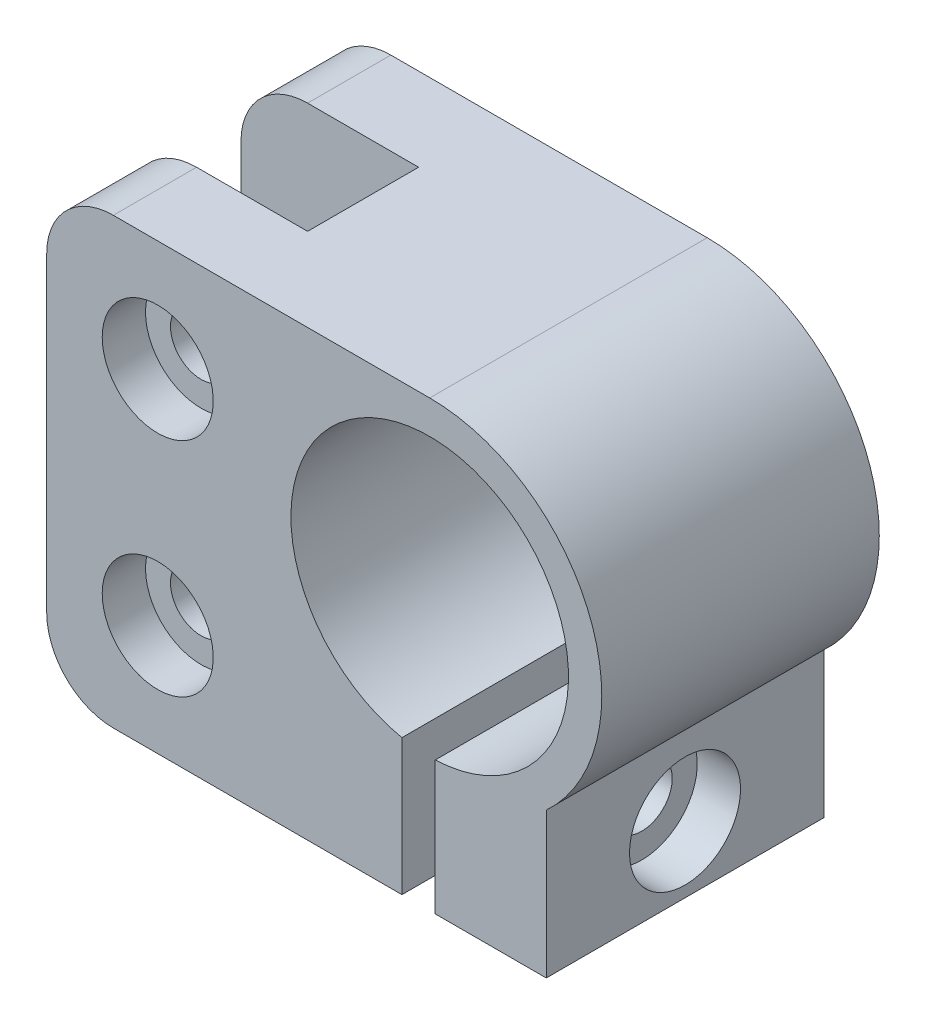
ISO-10303-21;
HEADER;
FILE_DESCRIPTION(('STEP AP214'),'2;1');
FILE_NAME('part.step','',(''),(''),'','','');
FILE_SCHEMA(('AUTOMOTIVE_DESIGN { 1 0 10303 214 1 1 1 1 }'));
ENDSEC;
DATA;
#1=APPLICATION_CONTEXT('core data for automotive mechanical design processes');
#2=APPLICATION_PROTOCOL_DEFINITION('international standard','automotive_design',2000,#1);
#3=PRODUCT_CONTEXT('',#1,'mechanical');
#4=PRODUCT('Part','Part','',(#3));
#5=PRODUCT_RELATED_PRODUCT_CATEGORY('part','',(#4));
#6=PRODUCT_DEFINITION_FORMATION('','',#4);
#7=PRODUCT_DEFINITION_CONTEXT('part definition',#1,'design');
#8=PRODUCT_DEFINITION('design','',#6,#7);
#9=PRODUCT_DEFINITION_SHAPE('','',#8);
#10=(LENGTH_UNIT() NAMED_UNIT(*) SI_UNIT(.MILLI.,.METRE.));
#11=(NAMED_UNIT(*) PLANE_ANGLE_UNIT() SI_UNIT($,.RADIAN.));
#12=(NAMED_UNIT(*) SI_UNIT($,.STERADIAN.) SOLID_ANGLE_UNIT());
#13=UNCERTAINTY_MEASURE_WITH_UNIT(LENGTH_MEASURE(1.E-05),#10,'distance_accuracy_value','');
#14=(GEOMETRIC_REPRESENTATION_CONTEXT(3) GLOBAL_UNCERTAINTY_ASSIGNED_CONTEXT((#13)) GLOBAL_UNIT_ASSIGNED_CONTEXT((#10,
#11,#12)) REPRESENTATION_CONTEXT('',''));
#15=CARTESIAN_POINT('',(0.,0.,0.));
#16=DIRECTION('',(0.,0.,1.));
#17=DIRECTION('',(1.,0.,0.));
#18=AXIS2_PLACEMENT_3D('',#15,#16,#17);
#19=CARTESIAN_POINT('',(12.,4.5,12.5));
#20=DIRECTION('',(0.,0.,-1.));
#21=DIRECTION('',(1.,0.,0.));
#22=AXIS2_PLACEMENT_3D('',#19,#20,#21);
#23=PLANE('',#22);
#24=CARTESIAN_POINT('',(-12.5,-10.,12.5));
#25=DIRECTION('',(0.,0.,-1.));
#26=DIRECTION('',(-1.,0.,0.));
#27=AXIS2_PLACEMENT_3D('',#24,#25,#26);
#28=CIRCLE('',#27,4.99999999999999);
#29=CARTESIAN_POINT('',(-17.5,-10.,12.5));
#30=VERTEX_POINT('',#29);
#31=EDGE_CURVE('E318',#30,#30,#28,.T.);
#32=ORIENTED_EDGE('',*,*,#31,.T.);
#33=EDGE_LOOP('',(#32));
#34=FACE_BOUND('',#33,.T.);
#35=DIRECTION('',(1.,0.,0.));
#36=VECTOR('',#35,1.);
#37=CARTESIAN_POINT('',(22.5,-20.,12.5));
#38=LINE('',#37,#36);
#39=CARTESIAN_POINT('',(12.5,-20.,12.5));
#40=VERTEX_POINT('',#39);
#41=CARTESIAN_POINT('',(22.5,-20.,12.5));
#42=VERTEX_POINT('',#41);
#43=EDGE_CURVE('E246',#40,#42,#38,.T.);
#44=ORIENTED_EDGE('',*,*,#43,.T.);
#45=DIRECTION('',(0.,1.,0.));
#46=VECTOR('',#45,1.);
#47=CARTESIAN_POINT('',(22.5,-6.90175425099139,12.5));
#48=LINE('',#47,#46);
#49=CARTESIAN_POINT('',(22.5,-6.90175425099139,12.5));
#50=VERTEX_POINT('',#49);
#51=EDGE_CURVE('E250',#42,#50,#48,.T.);
#52=ORIENTED_EDGE('',*,*,#51,.T.);
#53=CARTESIAN_POINT('',(12.,4.5,12.5));
#54=DIRECTION('',(0.,0.,1.));
#55=DIRECTION('',(1.,0.,0.));
#56=AXIS2_PLACEMENT_3D('',#53,#54,#55);
#57=CIRCLE('',#56,15.5);
#58=CARTESIAN_POINT('',(12.,20.,12.5));
#59=VERTEX_POINT('',#58);
#60=EDGE_CURVE('E253',#50,#59,#57,.T.);
#61=ORIENTED_EDGE('',*,*,#60,.T.);
#62=DIRECTION('',(-1.,0.,0.));
#63=VECTOR('',#62,1.);
#64=CARTESIAN_POINT('',(12.,20.,12.5));
#65=LINE('',#64,#63);
#66=CARTESIAN_POINT('',(-16.5,20.,12.5));
#67=VERTEX_POINT('',#66);
#68=EDGE_CURVE('E230',#59,#67,#65,.T.);
#69=ORIENTED_EDGE('',*,*,#68,.T.);
#70=CARTESIAN_POINT('',(-16.5,14.,12.5));
#71=DIRECTION('',(0.,0.,1.));
#72=DIRECTION('',(1.,0.,0.));
#73=AXIS2_PLACEMENT_3D('',#70,#71,#72);
#74=CIRCLE('',#73,6.);
#75=CARTESIAN_POINT('',(-22.5,14.,12.5));
#76=VERTEX_POINT('',#75);
#77=EDGE_CURVE('E271',#76,#67,#74,.F.);
#78=ORIENTED_EDGE('',*,*,#77,.F.);
#79=DIRECTION('',(0.,-1.,0.));
#80=VECTOR('',#79,1.);
#81=CARTESIAN_POINT('',(-22.5,20.,12.5));
#82=LINE('',#81,#80);
#83=CARTESIAN_POINT('',(-22.5,-14.,12.5));
#84=VERTEX_POINT('',#83);
#85=EDGE_CURVE('E219',#76,#84,#82,.T.);
#86=ORIENTED_EDGE('',*,*,#85,.T.);
#87=CARTESIAN_POINT('',(-16.5,-14.,12.5));
#88=DIRECTION('',(0.,0.,1.));
#89=DIRECTION('',(1.,0.,0.));
#90=AXIS2_PLACEMENT_3D('',#87,#88,#89);
#91=CIRCLE('',#90,6.);
#92=CARTESIAN_POINT('',(-16.5,-20.,12.5));
#93=VERTEX_POINT('',#92);
#94=EDGE_CURVE('E268',#93,#84,#91,.F.);
#95=ORIENTED_EDGE('',*,*,#94,.F.);
#96=CARTESIAN_POINT('',(9.5,-20.,12.5));
#97=VERTEX_POINT('',#96);
#98=EDGE_CURVE('E247',#93,#97,#38,.T.);
#99=ORIENTED_EDGE('',*,*,#98,.T.);
#100=DIRECTION('',(0.,1.,0.));
#101=VECTOR('',#100,1.);
#102=CARTESIAN_POINT('',(9.5,-20.,12.5));
#103=LINE('',#102,#101);
#104=CARTESIAN_POINT('',(9.5,-7.74744871391588,12.5));
#105=VERTEX_POINT('',#104);
#106=EDGE_CURVE('E182',#97,#105,#103,.T.);
#107=ORIENTED_EDGE('',*,*,#106,.T.);
#108=CARTESIAN_POINT('',(12.,4.5,12.5));
#109=DIRECTION('',(0.,0.,1.));
#110=DIRECTION('',(1.,0.,0.));
#111=AXIS2_PLACEMENT_3D('',#108,#109,#110);
#112=CIRCLE('',#111,12.5);
#113=CARTESIAN_POINT('',(12.5,-7.98999599679679,12.5));
#114=VERTEX_POINT('',#113);
#115=EDGE_CURVE('E193',#114,#105,#112,.T.);
#116=ORIENTED_EDGE('',*,*,#115,.F.);
#117=DIRECTION('',(0.,-1.,0.));
#118=VECTOR('',#117,1.);
#119=CARTESIAN_POINT('',(12.5,-20.,12.5));
#120=LINE('',#119,#118);
#121=EDGE_CURVE('E178',#114,#40,#120,.T.);
#122=ORIENTED_EDGE('',*,*,#121,.T.);
#123=EDGE_LOOP('',(#44,#52,#61,#69,#78,#86,#95,#99,#107,#116,#122));
#124=FACE_BOUND('',#123,.T.);
#125=CARTESIAN_POINT('',(-12.5,10.,12.5));
#126=DIRECTION('',(0.,0.,-1.));
#127=DIRECTION('',(-1.,0.,0.));
#128=AXIS2_PLACEMENT_3D('',#125,#126,#127);
#129=CIRCLE('',#128,4.99999999999999);
#130=CARTESIAN_POINT('',(-17.5,10.,12.5));
#131=VERTEX_POINT('',#130);
#132=EDGE_CURVE('E650',#131,#131,#129,.T.);
#133=ORIENTED_EDGE('',*,*,#132,.T.);
#134=EDGE_LOOP('',(#133));
#135=FACE_BOUND('',#134,.T.);
#136=ADVANCED_FACE('F35',(#34,#124,#135),#23,.F.);
#137=CARTESIAN_POINT('',(22.5,-20.,-12.5));
#138=DIRECTION('',(0.,1.,0.));
#139=DIRECTION('',(-1.,0.,0.));
#140=AXIS2_PLACEMENT_3D('',#137,#138,#139);
#141=PLANE('',#140);
#142=DIRECTION('',(1.,0.,0.));
#143=VECTOR('',#142,1.);
#144=CARTESIAN_POINT('',(22.5,-20.,-12.5));
#145=LINE('',#144,#143);
#146=CARTESIAN_POINT('',(12.5,-20.,-12.5));
#147=VERTEX_POINT('',#146);
#148=CARTESIAN_POINT('',(22.5,-20.,-12.5));
#149=VERTEX_POINT('',#148);
#150=EDGE_CURVE('E229',#147,#149,#145,.T.);
#151=ORIENTED_EDGE('',*,*,#150,.T.);
#152=DIRECTION('',(0.,0.,1.));
#153=VECTOR('',#152,1.);
#154=CARTESIAN_POINT('',(22.5,-20.,-12.5));
#155=LINE('',#154,#153);
#156=EDGE_CURVE('E261',#149,#42,#155,.T.);
#157=ORIENTED_EDGE('',*,*,#156,.T.);
#158=ORIENTED_EDGE('',*,*,#43,.F.);
#159=DIRECTION('',(0.,0.,1.));
#160=VECTOR('',#159,1.);
#161=CARTESIAN_POINT('',(12.5,-20.,-12.5));
#162=LINE('',#161,#160);
#163=EDGE_CURVE('E184',#147,#40,#162,.T.);
#164=ORIENTED_EDGE('',*,*,#163,.F.);
#165=EDGE_LOOP('',(#151,#157,#158,#164));
#166=FACE_BOUND('',#165,.T.);
#167=ADVANCED_FACE('F346',(#166),#141,.F.);
#168=CARTESIAN_POINT('',(-22.5,20.,-12.5));
#169=DIRECTION('',(1.,0.,0.));
#170=DIRECTION('',(0.,1.,0.));
#171=AXIS2_PLACEMENT_3D('',#168,#169,#170);
#172=PLANE('',#171);
#173=DIRECTION('',(0.,1.,0.));
#174=VECTOR('',#173,1.);
#175=CARTESIAN_POINT('',(-22.5,-20.,5.));
#176=LINE('',#175,#174);
#177=CARTESIAN_POINT('',(-22.5,-14.,5.));
#178=VERTEX_POINT('',#177);
#179=CARTESIAN_POINT('',(-22.5,14.,5.));
#180=VERTEX_POINT('',#179);
#181=EDGE_CURVE('E216',#178,#180,#176,.T.);
#182=ORIENTED_EDGE('',*,*,#181,.F.);
#183=DIRECTION('',(0.,0.,1.));
#184=VECTOR('',#183,1.);
#185=CARTESIAN_POINT('',(-22.5,-14.,-12.5));
#186=LINE('',#185,#184);
#187=EDGE_CURVE('E263',#84,#178,#186,.F.);
#188=ORIENTED_EDGE('',*,*,#187,.F.);
#189=ORIENTED_EDGE('',*,*,#85,.F.);
#190=DIRECTION('',(0.,0.,1.));
#191=VECTOR('',#190,1.);
#192=CARTESIAN_POINT('',(-22.5,14.,-12.5));
#193=LINE('',#192,#191);
#194=EDGE_CURVE('E266',#180,#76,#193,.T.);
#195=ORIENTED_EDGE('',*,*,#194,.F.);
#196=EDGE_LOOP('',(#182,#188,#189,#195));
#197=FACE_BOUND('',#196,.T.);
#198=ADVANCED_FACE('F352',(#197),#172,.F.);
#199=DIRECTION('',(0.,-1.,0.));
#200=VECTOR('',#199,1.);
#201=CARTESIAN_POINT('',(-22.5,20.,-12.5));
#202=LINE('',#201,#200);
#203=CARTESIAN_POINT('',(-22.5,14.,-12.5));
#204=VERTEX_POINT('',#203);
#205=CARTESIAN_POINT('',(-22.5,-14.,-12.5));
#206=VERTEX_POINT('',#205);
#207=EDGE_CURVE('E226',#204,#206,#202,.T.);
#208=ORIENTED_EDGE('',*,*,#207,.T.);
#209=DIRECTION('',(0.,0.,1.));
#210=VECTOR('',#209,1.);
#211=CARTESIAN_POINT('',(-22.5,-14.,-12.5));
#212=LINE('',#211,#210);
#213=CARTESIAN_POINT('',(-22.5,-14.,-5.));
#214=VERTEX_POINT('',#213);
#215=EDGE_CURVE('E284',#214,#206,#212,.F.);
#216=ORIENTED_EDGE('',*,*,#215,.F.);
#217=DIRECTION('',(0.,1.,0.));
#218=VECTOR('',#217,1.);
#219=CARTESIAN_POINT('',(-22.5,-20.,-5.));
#220=LINE('',#219,#218);
#221=CARTESIAN_POINT('',(-22.5,14.,-5.));
#222=VERTEX_POINT('',#221);
#223=EDGE_CURVE('E208',#214,#222,#220,.T.);
#224=ORIENTED_EDGE('',*,*,#223,.T.);
#225=DIRECTION('',(0.,0.,1.));
#226=VECTOR('',#225,1.);
#227=CARTESIAN_POINT('',(-22.5,14.,-12.5));
#228=LINE('',#227,#226);
#229=EDGE_CURVE('E287',#204,#222,#228,.T.);
#230=ORIENTED_EDGE('',*,*,#229,.F.);
#231=EDGE_LOOP('',(#208,#216,#224,#230));
#232=FACE_BOUND('',#231,.T.);
#233=ADVANCED_FACE('F375',(#232),#172,.F.);
#234=ORIENTED_EDGE('',*,*,#98,.F.);
#235=DIRECTION('',(0.,0.,1.));
#236=VECTOR('',#235,1.);
#237=CARTESIAN_POINT('',(-16.5,-20.,-12.5));
#238=LINE('',#237,#236);
#239=CARTESIAN_POINT('',(-16.5,-20.,5.));
#240=VERTEX_POINT('',#239);
#241=EDGE_CURVE('E298',#240,#93,#238,.T.);
#242=ORIENTED_EDGE('',*,*,#241,.F.);
#243=DIRECTION('',(-1.,0.,0.));
#244=VECTOR('',#243,1.);
#245=CARTESIAN_POINT('',(-22.5,-20.,5.));
#246=LINE('',#245,#244);
#247=CARTESIAN_POINT('',(-6.49999999999999,-20.,5.));
#248=VERTEX_POINT('',#247);
#249=EDGE_CURVE('E205',#248,#240,#246,.T.);
#250=ORIENTED_EDGE('',*,*,#249,.F.);
#251=DIRECTION('',(0.,0.,1.));
#252=VECTOR('',#251,1.);
#253=CARTESIAN_POINT('',(-6.49999999999999,-20.,5.));
#254=LINE('',#253,#252);
#255=CARTESIAN_POINT('',(-6.49999999999999,-20.,-5.));
#256=VERTEX_POINT('',#255);
#257=EDGE_CURVE('E201',#256,#248,#254,.T.);
#258=ORIENTED_EDGE('',*,*,#257,.F.);
#259=DIRECTION('',(1.,0.,0.));
#260=VECTOR('',#259,1.);
#261=CARTESIAN_POINT('',(-22.5,-20.,-5.));
#262=LINE('',#261,#260);
#263=CARTESIAN_POINT('',(-16.5,-20.,-5.));
#264=VERTEX_POINT('',#263);
#265=EDGE_CURVE('E198',#264,#256,#262,.T.);
#266=ORIENTED_EDGE('',*,*,#265,.F.);
#267=DIRECTION('',(0.,0.,1.));
#268=VECTOR('',#267,1.);
#269=CARTESIAN_POINT('',(-16.5,-20.,-12.5));
#270=LINE('',#269,#268);
#271=CARTESIAN_POINT('',(-16.5,-20.,-12.5));
#272=VERTEX_POINT('',#271);
#273=EDGE_CURVE('E300',#272,#264,#270,.T.);
#274=ORIENTED_EDGE('',*,*,#273,.F.);
#275=CARTESIAN_POINT('',(9.5,-20.,-12.5));
#276=VERTEX_POINT('',#275);
#277=EDGE_CURVE('E231',#272,#276,#145,.T.);
#278=ORIENTED_EDGE('',*,*,#277,.T.);
#279=DIRECTION('',(0.,0.,1.));
#280=VECTOR('',#279,1.);
#281=CARTESIAN_POINT('',(9.5,-20.,-12.5));
#282=LINE('',#281,#280);
#283=EDGE_CURVE('E189',#276,#97,#282,.T.);
#284=ORIENTED_EDGE('',*,*,#283,.T.);
#285=EDGE_LOOP('',(#234,#242,#250,#258,#266,#274,#278,#284));
#286=FACE_BOUND('',#285,.T.);
#287=ADVANCED_FACE('F355',(#286),#141,.F.);
#288=CARTESIAN_POINT('',(22.5,-6.90175425099139,-12.5));
#289=DIRECTION('',(-1.,0.,0.));
#290=DIRECTION('',(0.,-1.,0.));
#291=AXIS2_PLACEMENT_3D('',#288,#289,#290);
#292=PLANE('',#291);
#293=CARTESIAN_POINT('',(22.5,-14.,0.));
#294=DIRECTION('',(-1.,0.,0.));
#295=DIRECTION('',(0.,0.,1.));
#296=AXIS2_PLACEMENT_3D('',#293,#294,#295);
#297=CIRCLE('',#296,5.);
#298=CARTESIAN_POINT('',(22.5,-14.,5.));
#299=VERTEX_POINT('',#298);
#300=EDGE_CURVE('E324',#299,#299,#297,.T.);
#301=ORIENTED_EDGE('',*,*,#300,.T.);
#302=EDGE_LOOP('',(#301));
#303=FACE_BOUND('',#302,.T.);
#304=ORIENTED_EDGE('',*,*,#51,.F.);
#305=ORIENTED_EDGE('',*,*,#156,.F.);
#306=DIRECTION('',(0.,1.,0.));
#307=VECTOR('',#306,1.);
#308=CARTESIAN_POINT('',(22.5,-6.90175425099139,-12.5));
#309=LINE('',#308,#307);
#310=CARTESIAN_POINT('',(22.5,-6.90175425099139,-12.5));
#311=VERTEX_POINT('',#310);
#312=EDGE_CURVE('E234',#149,#311,#309,.T.);
#313=ORIENTED_EDGE('',*,*,#312,.T.);
#314=DIRECTION('',(0.,0.,1.));
#315=VECTOR('',#314,1.);
#316=CARTESIAN_POINT('',(22.5,-6.90175425099139,-12.5));
#317=LINE('',#316,#315);
#318=EDGE_CURVE('E259',#311,#50,#317,.T.);
#319=ORIENTED_EDGE('',*,*,#318,.T.);
#320=EDGE_LOOP('',(#304,#305,#313,#319));
#321=FACE_BOUND('',#320,.T.);
#322=ADVANCED_FACE('F369',(#303,#321),#292,.F.);
#323=CARTESIAN_POINT('',(12.,4.5,-12.5));
#324=DIRECTION('',(0.,0.,1.));
#325=DIRECTION('',(-1.,0.,0.));
#326=AXIS2_PLACEMENT_3D('',#323,#324,#325);
#327=CYLINDRICAL_SURFACE('',#326,15.5);
#328=ORIENTED_EDGE('',*,*,#60,.F.);
#329=ORIENTED_EDGE('',*,*,#318,.F.);
#330=CARTESIAN_POINT('',(12.,4.5,-12.5));
#331=DIRECTION('',(0.,0.,1.));
#332=DIRECTION('',(1.,0.,0.));
#333=AXIS2_PLACEMENT_3D('',#330,#331,#332);
#334=CIRCLE('',#333,15.5);
#335=CARTESIAN_POINT('',(12.,20.,-12.5));
#336=VERTEX_POINT('',#335);
#337=EDGE_CURVE('E237',#311,#336,#334,.T.);
#338=ORIENTED_EDGE('',*,*,#337,.T.);
#339=DIRECTION('',(0.,0.,1.));
#340=VECTOR('',#339,1.);
#341=CARTESIAN_POINT('',(12.,20.,-12.5));
#342=LINE('',#341,#340);
#343=EDGE_CURVE('E243',#336,#59,#342,.T.);
#344=ORIENTED_EDGE('',*,*,#343,.T.);
#345=EDGE_LOOP('',(#328,#329,#338,#344));
#346=FACE_BOUND('',#345,.T.);
#347=ADVANCED_FACE('F365',(#346),#327,.T.);
#348=CARTESIAN_POINT('',(12.,20.,-12.5));
#349=DIRECTION('',(0.,-1.,0.));
#350=DIRECTION('',(1.,0.,0.));
#351=AXIS2_PLACEMENT_3D('',#348,#349,#350);
#352=PLANE('',#351);
#353=ORIENTED_EDGE('',*,*,#68,.F.);
#354=ORIENTED_EDGE('',*,*,#343,.F.);
#355=DIRECTION('',(-1.,0.,0.));
#356=VECTOR('',#355,1.);
#357=CARTESIAN_POINT('',(12.,20.,-12.5));
#358=LINE('',#357,#356);
#359=CARTESIAN_POINT('',(-16.5,20.,-12.5));
#360=VERTEX_POINT('',#359);
#361=EDGE_CURVE('E240',#336,#360,#358,.T.);
#362=ORIENTED_EDGE('',*,*,#361,.T.);
#363=DIRECTION('',(0.,0.,1.));
#364=VECTOR('',#363,1.);
#365=CARTESIAN_POINT('',(-16.5,20.,-12.5));
#366=LINE('',#365,#364);
#367=CARTESIAN_POINT('',(-16.5,20.,-5.));
#368=VERTEX_POINT('',#367);
#369=EDGE_CURVE('E274',#368,#360,#366,.F.);
#370=ORIENTED_EDGE('',*,*,#369,.F.);
#371=DIRECTION('',(1.,0.,0.));
#372=VECTOR('',#371,1.);
#373=CARTESIAN_POINT('',(-22.5,20.,-5.));
#374=LINE('',#373,#372);
#375=CARTESIAN_POINT('',(-6.5,20.,-5.));
#376=VERTEX_POINT('',#375);
#377=EDGE_CURVE('E195',#368,#376,#374,.T.);
#378=ORIENTED_EDGE('',*,*,#377,.T.);
#379=DIRECTION('',(0.,0.,1.));
#380=VECTOR('',#379,1.);
#381=CARTESIAN_POINT('',(-6.5,20.,5.));
#382=LINE('',#381,#380);
#383=CARTESIAN_POINT('',(-6.5,20.,5.));
#384=VERTEX_POINT('',#383);
#385=EDGE_CURVE('E211',#376,#384,#382,.T.);
#386=ORIENTED_EDGE('',*,*,#385,.T.);
#387=DIRECTION('',(-1.,0.,0.));
#388=VECTOR('',#387,1.);
#389=CARTESIAN_POINT('',(-22.5,20.,5.));
#390=LINE('',#389,#388);
#391=CARTESIAN_POINT('',(-16.5,20.,5.));
#392=VERTEX_POINT('',#391);
#393=EDGE_CURVE('E202',#384,#392,#390,.T.);
#394=ORIENTED_EDGE('',*,*,#393,.T.);
#395=DIRECTION('',(0.,0.,1.));
#396=VECTOR('',#395,1.);
#397=CARTESIAN_POINT('',(-16.5,20.,-12.5));
#398=LINE('',#397,#396);
#399=EDGE_CURVE('E277',#67,#392,#398,.F.);
#400=ORIENTED_EDGE('',*,*,#399,.F.);
#401=EDGE_LOOP('',(#353,#354,#362,#370,#378,#386,#394,#400));
#402=FACE_BOUND('',#401,.T.);
#403=ADVANCED_FACE('F362',(#402),#352,.F.);
#404=CARTESIAN_POINT('',(12.,4.5,-12.5));
#405=DIRECTION('',(0.,0.,-1.));
#406=DIRECTION('',(1.,0.,0.));
#407=AXIS2_PLACEMENT_3D('',#404,#405,#406);
#408=PLANE('',#407);
#409=CARTESIAN_POINT('',(-12.5,10.,-12.5));
#410=DIRECTION('',(0.,0.,1.));
#411=DIRECTION('',(1.,0.,0.));
#412=AXIS2_PLACEMENT_3D('',#409,#410,#411);
#413=CIRCLE('',#412,2.75);
#414=CARTESIAN_POINT('',(-9.75,10.,-12.5));
#415=VERTEX_POINT('',#414);
#416=EDGE_CURVE('E657',#415,#415,#413,.T.);
#417=ORIENTED_EDGE('',*,*,#416,.T.);
#418=EDGE_LOOP('',(#417));
#419=FACE_BOUND('',#418,.T.);
#420=CARTESIAN_POINT('',(-12.5,-10.,-12.5));
#421=DIRECTION('',(0.,0.,1.));
#422=DIRECTION('',(1.,0.,0.));
#423=AXIS2_PLACEMENT_3D('',#420,#421,#422);
#424=CIRCLE('',#423,2.75);
#425=CARTESIAN_POINT('',(-9.75,-10.,-12.5));
#426=VERTEX_POINT('',#425);
#427=EDGE_CURVE('E305',#426,#426,#424,.T.);
#428=ORIENTED_EDGE('',*,*,#427,.T.);
#429=EDGE_LOOP('',(#428));
#430=FACE_BOUND('',#429,.T.);
#431=DIRECTION('',(0.,-1.,0.));
#432=VECTOR('',#431,1.);
#433=CARTESIAN_POINT('',(12.5,-20.,-12.5));
#434=LINE('',#433,#432);
#435=CARTESIAN_POINT('',(12.5,-7.98999599679679,-12.5));
#436=VERTEX_POINT('',#435);
#437=EDGE_CURVE('E179',#436,#147,#434,.T.);
#438=ORIENTED_EDGE('',*,*,#437,.F.);
#439=CARTESIAN_POINT('',(12.,4.5,-12.5));
#440=DIRECTION('',(0.,0.,1.));
#441=DIRECTION('',(1.,0.,0.));
#442=AXIS2_PLACEMENT_3D('',#439,#440,#441);
#443=CIRCLE('',#442,12.5);
#444=CARTESIAN_POINT('',(9.5,-7.74744871391588,-12.5));
#445=VERTEX_POINT('',#444);
#446=EDGE_CURVE('E191',#436,#445,#443,.T.);
#447=ORIENTED_EDGE('',*,*,#446,.T.);
#448=DIRECTION('',(0.,1.,0.));
#449=VECTOR('',#448,1.);
#450=CARTESIAN_POINT('',(9.5,-20.,-12.5));
#451=LINE('',#450,#449);
#452=EDGE_CURVE('E181',#276,#445,#451,.T.);
#453=ORIENTED_EDGE('',*,*,#452,.F.);
#454=ORIENTED_EDGE('',*,*,#277,.F.);
#455=CARTESIAN_POINT('',(-16.5,-14.,-12.5));
#456=DIRECTION('',(0.,0.,1.));
#457=DIRECTION('',(1.,0.,0.));
#458=AXIS2_PLACEMENT_3D('',#455,#456,#457);
#459=CIRCLE('',#458,6.);
#460=EDGE_CURVE('E294',#206,#272,#459,.T.);
#461=ORIENTED_EDGE('',*,*,#460,.F.);
#462=ORIENTED_EDGE('',*,*,#207,.F.);
#463=CARTESIAN_POINT('',(-16.5,14.,-12.5));
#464=DIRECTION('',(0.,0.,1.));
#465=DIRECTION('',(1.,0.,0.));
#466=AXIS2_PLACEMENT_3D('',#463,#464,#465);
#467=CIRCLE('',#466,6.);
#468=EDGE_CURVE('E296',#360,#204,#467,.T.);
#469=ORIENTED_EDGE('',*,*,#468,.F.);
#470=ORIENTED_EDGE('',*,*,#361,.F.);
#471=ORIENTED_EDGE('',*,*,#337,.F.);
#472=ORIENTED_EDGE('',*,*,#312,.F.);
#473=ORIENTED_EDGE('',*,*,#150,.F.);
#474=EDGE_LOOP('',(#438,#447,#453,#454,#461,#462,#469,#470,#471,#472,#473));
#475=FACE_BOUND('',#474,.T.);
#476=ADVANCED_FACE('F360',(#419,#430,#475),#408,.T.);
#477=CARTESIAN_POINT('',(-22.5,-20.,5.));
#478=DIRECTION('',(0.,0.,1.));
#479=DIRECTION('',(-1.,0.,0.));
#480=AXIS2_PLACEMENT_3D('',#477,#478,#479);
#481=PLANE('',#480);
#482=CARTESIAN_POINT('',(-12.5,10.,5.));
#483=DIRECTION('',(0.,0.,-1.));
#484=DIRECTION('',(-1.,0.,0.));
#485=AXIS2_PLACEMENT_3D('',#482,#483,#484);
#486=CIRCLE('',#485,2.75);
#487=CARTESIAN_POINT('',(-15.25,10.,5.));
#488=VERTEX_POINT('',#487);
#489=EDGE_CURVE('E660',#488,#488,#486,.T.);
#490=ORIENTED_EDGE('',*,*,#489,.F.);
#491=EDGE_LOOP('',(#490));
#492=FACE_BOUND('',#491,.T.);
#493=CARTESIAN_POINT('',(-12.5,-10.,5.));
#494=DIRECTION('',(0.,0.,-1.));
#495=DIRECTION('',(-1.,0.,0.));
#496=AXIS2_PLACEMENT_3D('',#493,#494,#495);
#497=CIRCLE('',#496,2.75);
#498=CARTESIAN_POINT('',(-15.25,-10.,5.));
#499=VERTEX_POINT('',#498);
#500=EDGE_CURVE('E310',#499,#499,#497,.T.);
#501=ORIENTED_EDGE('',*,*,#500,.F.);
#502=EDGE_LOOP('',(#501));
#503=FACE_BOUND('',#502,.T.);
#504=ORIENTED_EDGE('',*,*,#393,.F.);
#505=DIRECTION('',(0.,1.,0.));
#506=VECTOR('',#505,1.);
#507=CARTESIAN_POINT('',(-6.49999999999999,-20.,5.));
#508=LINE('',#507,#506);
#509=EDGE_CURVE('E220',#248,#384,#508,.T.);
#510=ORIENTED_EDGE('',*,*,#509,.F.);
#511=ORIENTED_EDGE('',*,*,#249,.T.);
#512=CARTESIAN_POINT('',(-16.5,-14.,5.));
#513=DIRECTION('',(0.,0.,-1.));
#514=DIRECTION('',(-1.,0.,0.));
#515=AXIS2_PLACEMENT_3D('',#512,#513,#514);
#516=CIRCLE('',#515,6.);
#517=EDGE_CURVE('E280',#178,#240,#516,.F.);
#518=ORIENTED_EDGE('',*,*,#517,.F.);
#519=ORIENTED_EDGE('',*,*,#181,.T.);
#520=CARTESIAN_POINT('',(-16.5,14.,5.));
#521=DIRECTION('',(0.,0.,-1.));
#522=DIRECTION('',(-1.,0.,0.));
#523=AXIS2_PLACEMENT_3D('',#520,#521,#522);
#524=CIRCLE('',#523,6.);
#525=EDGE_CURVE('E282',#392,#180,#524,.F.);
#526=ORIENTED_EDGE('',*,*,#525,.F.);
#527=EDGE_LOOP('',(#504,#510,#511,#518,#519,#526));
#528=FACE_BOUND('',#527,.T.);
#529=ADVANCED_FACE('F436',(#492,#503,#528),#481,.F.);
#530=CARTESIAN_POINT('',(-6.49999999999999,-20.,5.));
#531=DIRECTION('',(1.,0.,0.));
#532=DIRECTION('',(0.,1.,0.));
#533=AXIS2_PLACEMENT_3D('',#530,#531,#532);
#534=PLANE('',#533);
#535=ORIENTED_EDGE('',*,*,#385,.F.);
#536=DIRECTION('',(0.,1.,0.));
#537=VECTOR('',#536,1.);
#538=CARTESIAN_POINT('',(-6.49999999999999,-20.,-5.));
#539=LINE('',#538,#537);
#540=EDGE_CURVE('E222',#256,#376,#539,.T.);
#541=ORIENTED_EDGE('',*,*,#540,.F.);
#542=ORIENTED_EDGE('',*,*,#257,.T.);
#543=ORIENTED_EDGE('',*,*,#509,.T.);
#544=EDGE_LOOP('',(#535,#541,#542,#543));
#545=FACE_BOUND('',#544,.T.);
#546=ADVANCED_FACE('F438',(#545),#534,.F.);
#547=CARTESIAN_POINT('',(-22.5,-20.,-5.));
#548=DIRECTION('',(0.,0.,-1.));
#549=DIRECTION('',(1.,0.,0.));
#550=AXIS2_PLACEMENT_3D('',#547,#548,#549);
#551=PLANE('',#550);
#552=CARTESIAN_POINT('',(-12.5,10.,-5.));
#553=DIRECTION('',(0.,0.,1.));
#554=DIRECTION('',(1.,0.,0.));
#555=AXIS2_PLACEMENT_3D('',#552,#553,#554);
#556=CIRCLE('',#555,2.75);
#557=CARTESIAN_POINT('',(-9.75,10.,-5.));
#558=VERTEX_POINT('',#557);
#559=EDGE_CURVE('E39',#558,#558,#556,.T.);
#560=ORIENTED_EDGE('',*,*,#559,.F.);
#561=EDGE_LOOP('',(#560));
#562=FACE_BOUND('',#561,.T.);
#563=CARTESIAN_POINT('',(-12.5,-10.,-5.));
#564=DIRECTION('',(0.,0.,1.));
#565=DIRECTION('',(1.,0.,0.));
#566=AXIS2_PLACEMENT_3D('',#563,#564,#565);
#567=CIRCLE('',#566,2.75);
#568=CARTESIAN_POINT('',(-9.75,-10.,-5.));
#569=VERTEX_POINT('',#568);
#570=EDGE_CURVE('E303',#569,#569,#567,.T.);
#571=ORIENTED_EDGE('',*,*,#570,.F.);
#572=EDGE_LOOP('',(#571));
#573=FACE_BOUND('',#572,.T.);
#574=ORIENTED_EDGE('',*,*,#223,.F.);
#575=CARTESIAN_POINT('',(-16.5,-14.,-5.));
#576=DIRECTION('',(0.,0.,1.));
#577=DIRECTION('',(1.,0.,0.));
#578=AXIS2_PLACEMENT_3D('',#575,#576,#577);
#579=CIRCLE('',#578,6.);
#580=EDGE_CURVE('E290',#264,#214,#579,.F.);
#581=ORIENTED_EDGE('',*,*,#580,.F.);
#582=ORIENTED_EDGE('',*,*,#265,.T.);
#583=ORIENTED_EDGE('',*,*,#540,.T.);
#584=ORIENTED_EDGE('',*,*,#377,.F.);
#585=CARTESIAN_POINT('',(-16.5,14.,-5.));
#586=DIRECTION('',(0.,0.,1.));
#587=DIRECTION('',(1.,0.,0.));
#588=AXIS2_PLACEMENT_3D('',#585,#586,#587);
#589=CIRCLE('',#588,6.);
#590=EDGE_CURVE('E292',#222,#368,#589,.F.);
#591=ORIENTED_EDGE('',*,*,#590,.F.);
#592=EDGE_LOOP('',(#574,#581,#582,#583,#584,#591));
#593=FACE_BOUND('',#592,.T.);
#594=ADVANCED_FACE('F384',(#562,#573,#593),#551,.F.);
#595=CARTESIAN_POINT('',(-16.5,14.,-12.5));
#596=DIRECTION('',(0.,0.,1.));
#597=DIRECTION('',(-1.,0.,0.));
#598=AXIS2_PLACEMENT_3D('',#595,#596,#597);
#599=CYLINDRICAL_SURFACE('',#598,6.);
#600=ORIENTED_EDGE('',*,*,#525,.T.);
#601=ORIENTED_EDGE('',*,*,#194,.T.);
#602=ORIENTED_EDGE('',*,*,#77,.T.);
#603=ORIENTED_EDGE('',*,*,#399,.T.);
#604=EDGE_LOOP('',(#600,#601,#602,#603));
#605=FACE_BOUND('',#604,.T.);
#606=ADVANCED_FACE('F380',(#605),#599,.T.);
#607=CARTESIAN_POINT('',(-16.5,14.,-12.5));
#608=DIRECTION('',(0.,0.,1.));
#609=DIRECTION('',(-1.,0.,0.));
#610=AXIS2_PLACEMENT_3D('',#607,#608,#609);
#611=CYLINDRICAL_SURFACE('',#610,6.);
#612=ORIENTED_EDGE('',*,*,#468,.T.);
#613=ORIENTED_EDGE('',*,*,#229,.T.);
#614=ORIENTED_EDGE('',*,*,#590,.T.);
#615=ORIENTED_EDGE('',*,*,#369,.T.);
#616=EDGE_LOOP('',(#612,#613,#614,#615));
#617=FACE_BOUND('',#616,.T.);
#618=ADVANCED_FACE('F383',(#617),#611,.T.);
#619=CARTESIAN_POINT('',(-16.5,-14.,-12.5));
#620=DIRECTION('',(0.,0.,1.));
#621=DIRECTION('',(-1.,0.,0.));
#622=AXIS2_PLACEMENT_3D('',#619,#620,#621);
#623=CYLINDRICAL_SURFACE('',#622,6.);
#624=ORIENTED_EDGE('',*,*,#460,.T.);
#625=ORIENTED_EDGE('',*,*,#273,.T.);
#626=ORIENTED_EDGE('',*,*,#580,.T.);
#627=ORIENTED_EDGE('',*,*,#215,.T.);
#628=EDGE_LOOP('',(#624,#625,#626,#627));
#629=FACE_BOUND('',#628,.T.);
#630=ADVANCED_FACE('F387',(#629),#623,.T.);
#631=CARTESIAN_POINT('',(-16.5,-14.,-12.5));
#632=DIRECTION('',(0.,0.,1.));
#633=DIRECTION('',(-1.,0.,0.));
#634=AXIS2_PLACEMENT_3D('',#631,#632,#633);
#635=CYLINDRICAL_SURFACE('',#634,6.);
#636=ORIENTED_EDGE('',*,*,#517,.T.);
#637=ORIENTED_EDGE('',*,*,#241,.T.);
#638=ORIENTED_EDGE('',*,*,#94,.T.);
#639=ORIENTED_EDGE('',*,*,#187,.T.);
#640=EDGE_LOOP('',(#636,#637,#638,#639));
#641=FACE_BOUND('',#640,.T.);
#642=ADVANCED_FACE('F37',(#641),#635,.T.);
#643=CARTESIAN_POINT('',(12.,4.5,12.5));
#644=DIRECTION('',(0.,0.,-1.));
#645=DIRECTION('',(1.,0.,0.));
#646=AXIS2_PLACEMENT_3D('',#643,#644,#645);
#647=CYLINDRICAL_SURFACE('',#646,12.5);
#648=ORIENTED_EDGE('',*,*,#115,.T.);
#649=DIRECTION('',(0.,0.,-1.));
#650=VECTOR('',#649,1.);
#651=CARTESIAN_POINT('',(9.5,-7.74744871391588,12.5));
#652=LINE('',#651,#650);
#653=EDGE_CURVE('E44',#445,#105,#652,.F.);
#654=ORIENTED_EDGE('',*,*,#653,.F.);
#655=ORIENTED_EDGE('',*,*,#446,.F.);
#656=DIRECTION('',(0.,0.,-1.));
#657=VECTOR('',#656,1.);
#658=CARTESIAN_POINT('',(12.5,-7.98999599679679,12.5));
#659=LINE('',#658,#657);
#660=EDGE_CURVE('E11',#114,#436,#659,.T.);
#661=ORIENTED_EDGE('',*,*,#660,.F.);
#662=EDGE_LOOP('',(#648,#654,#655,#661));
#663=FACE_BOUND('',#662,.T.);
#664=ADVANCED_FACE('F394',(#663),#647,.F.);
#665=CARTESIAN_POINT('',(9.5,-20.,-12.5));
#666=DIRECTION('',(-1.,0.,0.));
#667=DIRECTION('',(0.,0.,-1.));
#668=AXIS2_PLACEMENT_3D('',#665,#666,#667);
#669=PLANE('',#668);
#670=CARTESIAN_POINT('',(9.5,-14.,0.));
#671=DIRECTION('',(1.,0.,0.));
#672=DIRECTION('',(0.,0.,-1.));
#673=AXIS2_PLACEMENT_3D('',#670,#671,#672);
#674=CIRCLE('',#673,2.75);
#675=CARTESIAN_POINT('',(9.5,-14.,-2.75));
#676=VERTEX_POINT('',#675);
#677=EDGE_CURVE('E165',#676,#676,#674,.T.);
#678=ORIENTED_EDGE('',*,*,#677,.F.);
#679=EDGE_LOOP('',(#678));
#680=FACE_BOUND('',#679,.T.);
#681=ORIENTED_EDGE('',*,*,#452,.T.);
#682=ORIENTED_EDGE('',*,*,#653,.T.);
#683=ORIENTED_EDGE('',*,*,#106,.F.);
#684=ORIENTED_EDGE('',*,*,#283,.F.);
#685=EDGE_LOOP('',(#681,#682,#683,#684));
#686=FACE_BOUND('',#685,.T.);
#687=ADVANCED_FACE('F428',(#680,#686),#669,.F.);
#688=CARTESIAN_POINT('',(12.5,-20.,-12.5));
#689=DIRECTION('',(1.,0.,0.));
#690=DIRECTION('',(0.,1.,0.));
#691=AXIS2_PLACEMENT_3D('',#688,#689,#690);
#692=PLANE('',#691);
#693=CARTESIAN_POINT('',(12.5,-14.,0.));
#694=DIRECTION('',(-1.,0.,0.));
#695=DIRECTION('',(0.,1.,0.));
#696=AXIS2_PLACEMENT_3D('',#693,#694,#695);
#697=CIRCLE('',#696,2.75);
#698=CARTESIAN_POINT('',(12.5,-11.25,0.));
#699=VERTEX_POINT('',#698);
#700=EDGE_CURVE('E169',#699,#699,#697,.T.);
#701=ORIENTED_EDGE('',*,*,#700,.F.);
#702=EDGE_LOOP('',(#701));
#703=FACE_BOUND('',#702,.T.);
#704=ORIENTED_EDGE('',*,*,#121,.F.);
#705=ORIENTED_EDGE('',*,*,#660,.T.);
#706=ORIENTED_EDGE('',*,*,#437,.T.);
#707=ORIENTED_EDGE('',*,*,#163,.T.);
#708=EDGE_LOOP('',(#704,#705,#706,#707));
#709=FACE_BOUND('',#708,.T.);
#710=ADVANCED_FACE('F342',(#703,#709),#692,.F.);
#711=CARTESIAN_POINT('',(22.5,-14.,0.));
#712=DIRECTION('',(1.,0.,0.));
#713=DIRECTION('',(0.,0.,1.));
#714=AXIS2_PLACEMENT_3D('',#711,#712,#713);
#715=CYLINDRICAL_SURFACE('',#714,2.75);
#716=CARTESIAN_POINT('',(18.6,-14.,0.));
#717=DIRECTION('',(-1.,0.,0.));
#718=DIRECTION('',(0.,0.,1.));
#719=AXIS2_PLACEMENT_3D('',#716,#717,#718);
#720=CIRCLE('',#719,2.75);
#721=CARTESIAN_POINT('',(18.6,-14.,2.75));
#722=VERTEX_POINT('',#721);
#723=EDGE_CURVE('E166',#722,#722,#720,.T.);
#724=ORIENTED_EDGE('',*,*,#723,.F.);
#725=EDGE_LOOP('',(#724));
#726=FACE_BOUND('',#725,.T.);
#727=ORIENTED_EDGE('',*,*,#700,.T.);
#728=EDGE_LOOP('',(#727));
#729=FACE_BOUND('',#728,.T.);
#730=ADVANCED_FACE('F334',(#726,#729),#715,.F.);
#731=CARTESIAN_POINT('',(18.6,-11.25,0.));
#732=DIRECTION('',(-1.,0.,0.));
#733=DIRECTION('',(0.,0.,-1.));
#734=AXIS2_PLACEMENT_3D('',#731,#732,#733);
#735=PLANE('',#734);
#736=ORIENTED_EDGE('',*,*,#723,.T.);
#737=EDGE_LOOP('',(#736));
#738=FACE_BOUND('',#737,.T.);
#739=CARTESIAN_POINT('',(18.6,-14.,0.));
#740=DIRECTION('',(-1.,0.,0.));
#741=DIRECTION('',(0.,0.,1.));
#742=AXIS2_PLACEMENT_3D('',#739,#740,#741);
#743=CIRCLE('',#742,5.);
#744=CARTESIAN_POINT('',(18.6,-14.,5.));
#745=VERTEX_POINT('',#744);
#746=EDGE_CURVE('E172',#745,#745,#743,.T.);
#747=ORIENTED_EDGE('',*,*,#746,.F.);
#748=EDGE_LOOP('',(#747));
#749=FACE_BOUND('',#748,.T.);
#750=ADVANCED_FACE('F332',(#738,#749),#735,.F.);
#751=CARTESIAN_POINT('',(22.5,-14.,0.));
#752=DIRECTION('',(1.,0.,0.));
#753=DIRECTION('',(0.,0.,1.));
#754=AXIS2_PLACEMENT_3D('',#751,#752,#753);
#755=CYLINDRICAL_SURFACE('',#754,5.);
#756=ORIENTED_EDGE('',*,*,#746,.T.);
#757=EDGE_LOOP('',(#756));
#758=FACE_BOUND('',#757,.T.);
#759=ORIENTED_EDGE('',*,*,#300,.F.);
#760=EDGE_LOOP('',(#759));
#761=FACE_BOUND('',#760,.T.);
#762=ADVANCED_FACE('F329',(#758,#761),#755,.F.);
#763=CARTESIAN_POINT('',(-4.5,-14.,0.));
#764=DIRECTION('',(-1.,0.,0.));
#765=DIRECTION('',(0.,0.,1.));
#766=AXIS2_PLACEMENT_3D('',#763,#764,#765);
#767=CIRCLE('',#766,2.74999999999999);
#768=CARTESIAN_POINT('',(-4.5,-14.,2.74999999999999));
#769=VERTEX_POINT('',#768);
#770=EDGE_CURVE('E163',#769,#769,#767,.T.);
#771=ORIENTED_EDGE('',*,*,#770,.T.);
#772=EDGE_LOOP('',(#771));
#773=FACE_BOUND('',#772,.T.);
#774=ORIENTED_EDGE('',*,*,#677,.T.);
#775=EDGE_LOOP('',(#774));
#776=FACE_BOUND('',#775,.T.);
#777=ADVANCED_FACE('F159',(#773,#776),#715,.F.);
#778=CARTESIAN_POINT('',(-4.5,-14.,0.));
#779=DIRECTION('',(1.,0.,0.));
#780=DIRECTION('',(0.,0.,1.));
#781=AXIS2_PLACEMENT_3D('',#778,#779,#780);
#782=CONICAL_SURFACE('',#781,2.74999999999999,1.02974425867665);
#783=CARTESIAN_POINT('',(-6.15236670232579,-14.,0.));
#784=VERTEX_POINT('',#783);
#785=VERTEX_LOOP('',#784);
#786=FACE_BOUND('',#785,.T.);
#787=ORIENTED_EDGE('',*,*,#770,.F.);
#788=EDGE_LOOP('',(#787));
#789=FACE_BOUND('',#788,.T.);
#790=ADVANCED_FACE('F155',(#786,#789),#782,.F.);
#791=CARTESIAN_POINT('',(-12.5,-10.,12.5));
#792=DIRECTION('',(0.,0.,1.));
#793=DIRECTION('',(-1.,0.,0.));
#794=AXIS2_PLACEMENT_3D('',#791,#792,#793);
#795=CYLINDRICAL_SURFACE('',#794,2.75);
#796=ORIENTED_EDGE('',*,*,#427,.F.);
#797=EDGE_LOOP('',(#796));
#798=FACE_BOUND('',#797,.T.);
#799=ORIENTED_EDGE('',*,*,#570,.T.);
#800=EDGE_LOOP('',(#799));
#801=FACE_BOUND('',#800,.T.);
#802=ADVANCED_FACE('F158',(#798,#801),#795,.F.);
#803=CARTESIAN_POINT('',(-12.5,-10.,8.6));
#804=DIRECTION('',(0.,0.,-1.));
#805=DIRECTION('',(-1.,0.,0.));
#806=AXIS2_PLACEMENT_3D('',#803,#804,#805);
#807=CIRCLE('',#806,2.75);
#808=CARTESIAN_POINT('',(-15.25,-10.,8.6));
#809=VERTEX_POINT('',#808);
#810=EDGE_CURVE('E306',#809,#809,#807,.T.);
#811=ORIENTED_EDGE('',*,*,#810,.F.);
#812=EDGE_LOOP('',(#811));
#813=FACE_BOUND('',#812,.T.);
#814=ORIENTED_EDGE('',*,*,#500,.T.);
#815=EDGE_LOOP('',(#814));
#816=FACE_BOUND('',#815,.T.);
#817=ADVANCED_FACE('F573',(#813,#816),#795,.F.);
#818=CARTESIAN_POINT('',(-9.75,-10.,8.6));
#819=DIRECTION('',(0.,0.,-1.));
#820=DIRECTION('',(1.,0.,0.));
#821=AXIS2_PLACEMENT_3D('',#818,#819,#820);
#822=PLANE('',#821);
#823=ORIENTED_EDGE('',*,*,#810,.T.);
#824=EDGE_LOOP('',(#823));
#825=FACE_BOUND('',#824,.T.);
#826=CARTESIAN_POINT('',(-12.5,-10.,8.6));
#827=DIRECTION('',(0.,0.,-1.));
#828=DIRECTION('',(-1.,0.,0.));
#829=AXIS2_PLACEMENT_3D('',#826,#827,#828);
#830=CIRCLE('',#829,4.99999999999999);
#831=CARTESIAN_POINT('',(-17.5,-10.,8.6));
#832=VERTEX_POINT('',#831);
#833=EDGE_CURVE('E313',#832,#832,#830,.T.);
#834=ORIENTED_EDGE('',*,*,#833,.F.);
#835=EDGE_LOOP('',(#834));
#836=FACE_BOUND('',#835,.T.);
#837=ADVANCED_FACE('F583',(#825,#836),#822,.F.);
#838=CARTESIAN_POINT('',(-12.5,-10.,12.5));
#839=DIRECTION('',(0.,0.,1.));
#840=DIRECTION('',(-1.,0.,0.));
#841=AXIS2_PLACEMENT_3D('',#838,#839,#840);
#842=CYLINDRICAL_SURFACE('',#841,4.99999999999999);
#843=ORIENTED_EDGE('',*,*,#833,.T.);
#844=EDGE_LOOP('',(#843));
#845=FACE_BOUND('',#844,.T.);
#846=ORIENTED_EDGE('',*,*,#31,.F.);
#847=EDGE_LOOP('',(#846));
#848=FACE_BOUND('',#847,.T.);
#849=ADVANCED_FACE('F592',(#845,#848),#842,.F.);
#850=CARTESIAN_POINT('',(-12.5,10.,12.5));
#851=DIRECTION('',(0.,0.,1.));
#852=DIRECTION('',(-1.,0.,0.));
#853=AXIS2_PLACEMENT_3D('',#850,#851,#852);
#854=CYLINDRICAL_SURFACE('',#853,2.75);
#855=ORIENTED_EDGE('',*,*,#416,.F.);
#856=EDGE_LOOP('',(#855));
#857=FACE_BOUND('',#856,.T.);
#858=ORIENTED_EDGE('',*,*,#559,.T.);
#859=EDGE_LOOP('',(#858));
#860=FACE_BOUND('',#859,.T.);
#861=ADVANCED_FACE('F601',(#857,#860),#854,.F.);
#862=CARTESIAN_POINT('',(-12.5,10.,8.6));
#863=DIRECTION('',(0.,0.,-1.));
#864=DIRECTION('',(-1.,0.,0.));
#865=AXIS2_PLACEMENT_3D('',#862,#863,#864);
#866=CIRCLE('',#865,2.75);
#867=CARTESIAN_POINT('',(-15.25,10.,8.6));
#868=VERTEX_POINT('',#867);
#869=EDGE_CURVE('E652',#868,#868,#866,.T.);
#870=ORIENTED_EDGE('',*,*,#869,.F.);
#871=EDGE_LOOP('',(#870));
#872=FACE_BOUND('',#871,.T.);
#873=ORIENTED_EDGE('',*,*,#489,.T.);
#874=EDGE_LOOP('',(#873));
#875=FACE_BOUND('',#874,.T.);
#876=ADVANCED_FACE('F611',(#872,#875),#854,.F.);
#877=CARTESIAN_POINT('',(-9.75,10.,8.6));
#878=DIRECTION('',(0.,0.,-1.));
#879=DIRECTION('',(1.,0.,0.));
#880=AXIS2_PLACEMENT_3D('',#877,#878,#879);
#881=PLANE('',#880);
#882=ORIENTED_EDGE('',*,*,#869,.T.);
#883=EDGE_LOOP('',(#882));
#884=FACE_BOUND('',#883,.T.);
#885=CARTESIAN_POINT('',(-12.5,10.,8.6));
#886=DIRECTION('',(0.,0.,-1.));
#887=DIRECTION('',(-1.,0.,0.));
#888=AXIS2_PLACEMENT_3D('',#885,#886,#887);
#889=CIRCLE('',#888,4.99999999999999);
#890=CARTESIAN_POINT('',(-17.5,10.,8.6));
#891=VERTEX_POINT('',#890);
#892=EDGE_CURVE('E647',#891,#891,#889,.T.);
#893=ORIENTED_EDGE('',*,*,#892,.F.);
#894=EDGE_LOOP('',(#893));
#895=FACE_BOUND('',#894,.T.);
#896=ADVANCED_FACE('F621',(#884,#895),#881,.F.);
#897=CARTESIAN_POINT('',(-12.5,10.,12.5));
#898=DIRECTION('',(0.,0.,1.));
#899=DIRECTION('',(-1.,0.,0.));
#900=AXIS2_PLACEMENT_3D('',#897,#898,#899);
#901=CYLINDRICAL_SURFACE('',#900,4.99999999999999);
#902=ORIENTED_EDGE('',*,*,#892,.T.);
#903=EDGE_LOOP('',(#902));
#904=FACE_BOUND('',#903,.T.);
#905=ORIENTED_EDGE('',*,*,#132,.F.);
#906=EDGE_LOOP('',(#905));
#907=FACE_BOUND('',#906,.T.);
#908=ADVANCED_FACE('F630',(#904,#907),#901,.F.);
#909=CLOSED_SHELL('',(#136,#167,#198,#233,#287,#322,#347,#403,#476,#529,#546,#594,#606,#618,
#630,#642,#664,#687,#710,#730,#750,#762,#777,#790,#802,#817,#837,#849,#861,#876,#896,#908));
#910=MANIFOLD_SOLID_BREP('B2',#909);
#911=ADVANCED_BREP_SHAPE_REPRESENTATION('',(#18,#910),#14);
#912=SHAPE_DEFINITION_REPRESENTATION(#9,#911);
ENDSEC;
END-ISO-10303-21;
